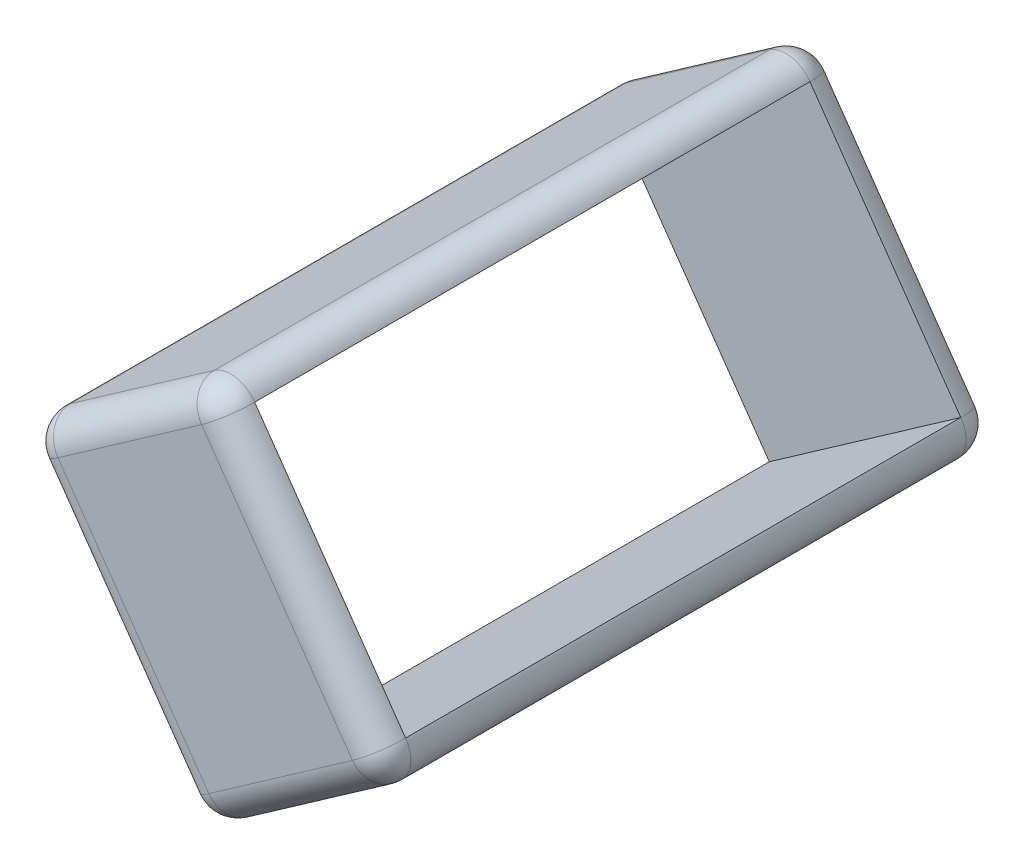
ISO-10303-21;
HEADER;
FILE_DESCRIPTION(('STEP AP214'),'2;1');
FILE_NAME('part.step','',(''),(''),'','','');
FILE_SCHEMA(('AUTOMOTIVE_DESIGN { 1 0 10303 214 1 1 1 1 }'));
ENDSEC;
DATA;
#1=APPLICATION_CONTEXT('core data for automotive mechanical design processes');
#2=APPLICATION_PROTOCOL_DEFINITION('international standard','automotive_design',2000,#1);
#3=PRODUCT_CONTEXT('',#1,'mechanical');
#4=PRODUCT('Part','Part','',(#3));
#5=PRODUCT_RELATED_PRODUCT_CATEGORY('part','',(#4));
#6=PRODUCT_DEFINITION_FORMATION('','',#4);
#7=PRODUCT_DEFINITION_CONTEXT('part definition',#1,'design');
#8=PRODUCT_DEFINITION('design','',#6,#7);
#9=PRODUCT_DEFINITION_SHAPE('','',#8);
#10=(LENGTH_UNIT() NAMED_UNIT(*) SI_UNIT(.MILLI.,.METRE.));
#11=(NAMED_UNIT(*) PLANE_ANGLE_UNIT() SI_UNIT($,.RADIAN.));
#12=(NAMED_UNIT(*) SI_UNIT($,.STERADIAN.) SOLID_ANGLE_UNIT());
#13=UNCERTAINTY_MEASURE_WITH_UNIT(LENGTH_MEASURE(1.E-05),#10,'distance_accuracy_value','');
#14=(GEOMETRIC_REPRESENTATION_CONTEXT(3) GLOBAL_UNCERTAINTY_ASSIGNED_CONTEXT((#13)) GLOBAL_UNIT_ASSIGNED_CONTEXT((#10,
#11,#12)) REPRESENTATION_CONTEXT('',''));
#15=CARTESIAN_POINT('',(0.,0.,0.));
#16=DIRECTION('',(0.,0.,1.));
#17=DIRECTION('',(1.,0.,0.));
#18=AXIS2_PLACEMENT_3D('',#15,#16,#17);
#19=CARTESIAN_POINT('',(11.0628027319125,-43.773106852629,10.5));
#20=DIRECTION('',(0.573576436351045,-0.819152044288993,0.));
#21=DIRECTION('',(0.819152044288993,0.573576436351045,0.));
#22=AXIS2_PLACEMENT_3D('',#19,#20,#21);
#23=PLANE('',#22);
#24=DIRECTION('',(0.,0.,-1.));
#25=VECTOR('',#24,1.);
#26=CARTESIAN_POINT('',(16.7968670419355,-39.7580717981717,10.5));
#27=LINE('',#26,#25);
#28=CARTESIAN_POINT('',(16.7968670419355,-39.7580717981717,9.5));
#29=VERTEX_POINT('',#28);
#30=CARTESIAN_POINT('',(16.7968670419355,-39.7580717981717,-9.5));
#31=VERTEX_POINT('',#30);
#32=EDGE_CURVE('E160',#29,#31,#27,.T.);
#33=ORIENTED_EDGE('',*,*,#32,.T.);
#34=DIRECTION('',(-0.819152044288993,-0.573576436351045,0.));
#35=VECTOR('',#34,1.);
#36=CARTESIAN_POINT('',(11.0628027319125,-43.773106852629,-9.5));
#37=LINE('',#36,#35);
#38=CARTESIAN_POINT('',(11.8819547762015,-43.199530416278,-9.5));
#39=VERTEX_POINT('',#38);
#40=EDGE_CURVE('E179',#31,#39,#37,.T.);
#41=ORIENTED_EDGE('',*,*,#40,.T.);
#42=DIRECTION('',(0.,0.,-1.));
#43=VECTOR('',#42,1.);
#44=CARTESIAN_POINT('',(11.8819547762015,-43.199530416278,10.5));
#45=LINE('',#44,#43);
#46=CARTESIAN_POINT('',(11.8819547762015,-43.199530416278,9.5));
#47=VERTEX_POINT('',#46);
#48=EDGE_CURVE('E278',#39,#47,#45,.F.);
#49=ORIENTED_EDGE('',*,*,#48,.T.);
#50=DIRECTION('',(-0.819152044288993,-0.573576436351045,0.));
#51=VECTOR('',#50,1.);
#52=CARTESIAN_POINT('',(17.6160190862244,-39.1844953618206,9.5));
#53=LINE('',#52,#51);
#54=EDGE_CURVE('E273',#47,#29,#53,.F.);
#55=ORIENTED_EDGE('',*,*,#54,.T.);
#56=EDGE_LOOP('',(#33,#41,#49,#55));
#57=FACE_BOUND('',#56,.T.);
#58=ADVANCED_FACE('F41',(#57),#23,.F.);
#59=CARTESIAN_POINT('',(23.9253598860859,-48.1951678489996,10.5));
#60=DIRECTION('',(-0.573576436351045,0.819152044288993,0.));
#61=DIRECTION('',(-0.819152044288993,-0.573576436351045,0.));
#62=AXIS2_PLACEMENT_3D('',#59,#60,#61);
#63=PLANE('',#62);
#64=DIRECTION('',(0.,0.,-1.));
#65=VECTOR('',#64,1.);
#66=CARTESIAN_POINT('',(18.191295576063,-52.2102029034569,10.5));
#67=LINE('',#66,#65);
#68=CARTESIAN_POINT('',(18.191295576063,-52.2102029034569,9.5));
#69=VERTEX_POINT('',#68);
#70=CARTESIAN_POINT('',(18.191295576063,-52.2102029034569,-9.5));
#71=VERTEX_POINT('',#70);
#72=EDGE_CURVE('E207',#69,#71,#67,.T.);
#73=ORIENTED_EDGE('',*,*,#72,.T.);
#74=DIRECTION('',(0.819152044288993,0.573576436351045,0.));
#75=VECTOR('',#74,1.);
#76=CARTESIAN_POINT('',(23.9253598860859,-48.1951678489996,-9.5));
#77=LINE('',#76,#75);
#78=CARTESIAN_POINT('',(23.1062078417969,-48.7687442853506,-9.5));
#79=VERTEX_POINT('',#78);
#80=EDGE_CURVE('E210',#71,#79,#77,.T.);
#81=ORIENTED_EDGE('',*,*,#80,.T.);
#82=DIRECTION('',(0.,0.,-1.));
#83=VECTOR('',#82,1.);
#84=CARTESIAN_POINT('',(23.1062078417969,-48.7687442853506,10.5));
#85=LINE('',#84,#83);
#86=CARTESIAN_POINT('',(23.1062078417969,-48.7687442853506,9.5));
#87=VERTEX_POINT('',#86);
#88=EDGE_CURVE('E205',#79,#87,#85,.F.);
#89=ORIENTED_EDGE('',*,*,#88,.T.);
#90=DIRECTION('',(0.819152044288993,0.573576436351045,0.));
#91=VECTOR('',#90,1.);
#92=CARTESIAN_POINT('',(17.372143531774,-52.7837793398079,9.5));
#93=LINE('',#92,#91);
#94=EDGE_CURVE('E203',#87,#69,#93,.F.);
#95=ORIENTED_EDGE('',*,*,#94,.T.);
#96=EDGE_LOOP('',(#73,#81,#89,#95));
#97=FACE_BOUND('',#96,.T.);
#98=ADVANCED_FACE('F339',(#97),#63,.F.);
#99=CARTESIAN_POINT('',(11.0628027319125,-43.773106852629,10.5));
#100=DIRECTION('',(0.,0.,1.));
#101=DIRECTION('',(1.,0.,0.));
#102=AXIS2_PLACEMENT_3D('',#99,#100,#101);
#103=PLANE('',#102);
#104=DIRECTION('',(0.819152044288993,0.573576436351045,0.));
#105=VECTOR('',#104,1.);
#106=CARTESIAN_POINT('',(23.3517834497349,-47.3760158047106,10.5));
#107=LINE('',#106,#105);
#108=CARTESIAN_POINT('',(17.6177191397119,-51.3910508591679,10.5));
#109=VERTEX_POINT('',#108);
#110=CARTESIAN_POINT('',(22.5326314054459,-47.9495922410616,10.5));
#111=VERTEX_POINT('',#110);
#112=EDGE_CURVE('E50',#109,#111,#107,.T.);
#113=ORIENTED_EDGE('',*,*,#112,.T.);
#114=DIRECTION('',(-0.573576436351044,0.819152044288993,0.));
#115=VECTOR('',#114,1.);
#116=CARTESIAN_POINT('',(16.7968670419355,-39.7580717981717,10.5));
#117=LINE('',#116,#115);
#118=CARTESIAN_POINT('',(17.3704434782865,-40.5772238424607,10.5));
#119=VERTEX_POINT('',#118);
#120=EDGE_CURVE('E11',#111,#119,#117,.T.);
#121=ORIENTED_EDGE('',*,*,#120,.T.);
#122=DIRECTION('',(-0.819152044288993,-0.573576436351045,0.));
#123=VECTOR('',#122,1.);
#124=CARTESIAN_POINT('',(11.6363791682635,-44.592258896918,10.5));
#125=LINE('',#124,#123);
#126=CARTESIAN_POINT('',(12.4555312125525,-44.0186824605669,10.5));
#127=VERTEX_POINT('',#126);
#128=EDGE_CURVE('E212',#119,#127,#125,.T.);
#129=ORIENTED_EDGE('',*,*,#128,.T.);
#130=DIRECTION('',(0.573576436351045,-0.819152044288993,0.));
#131=VECTOR('',#130,1.);
#132=CARTESIAN_POINT('',(18.191295576063,-52.2102029034569,10.5));
#133=LINE('',#132,#131);
#134=EDGE_CURVE('E61',#127,#109,#133,.T.);
#135=ORIENTED_EDGE('',*,*,#134,.T.);
#136=EDGE_LOOP('',(#113,#121,#129,#135));
#137=FACE_BOUND('',#136,.T.);
#138=ADVANCED_FACE('F337',(#137),#103,.T.);
#139=CARTESIAN_POINT('',(11.0628027319125,-43.773106852629,-10.5));
#140=DIRECTION('',(0.,0.,1.));
#141=DIRECTION('',(1.,0.,0.));
#142=AXIS2_PLACEMENT_3D('',#139,#140,#141);
#143=PLANE('',#142);
#144=DIRECTION('',(0.573576436351045,-0.819152044288993,0.));
#145=VECTOR('',#144,1.);
#146=CARTESIAN_POINT('',(11.8819547762015,-43.199530416278,-10.5));
#147=LINE('',#146,#145);
#148=CARTESIAN_POINT('',(17.6177191397119,-51.3910508591679,-10.5));
#149=VERTEX_POINT('',#148);
#150=CARTESIAN_POINT('',(12.4555312125525,-44.0186824605669,-10.5));
#151=VERTEX_POINT('',#150);
#152=EDGE_CURVE('E198',#149,#151,#147,.F.);
#153=ORIENTED_EDGE('',*,*,#152,.T.);
#154=DIRECTION('',(-0.819152044288993,-0.573576436351045,0.));
#155=VECTOR('',#154,1.);
#156=CARTESIAN_POINT('',(11.6363791682635,-44.592258896918,-10.5));
#157=LINE('',#156,#155);
#158=CARTESIAN_POINT('',(17.3704434782865,-40.5772238424607,-10.5));
#159=VERTEX_POINT('',#158);
#160=EDGE_CURVE('E201',#151,#159,#157,.F.);
#161=ORIENTED_EDGE('',*,*,#160,.T.);
#162=DIRECTION('',(-0.573576436351044,0.819152044288993,0.));
#163=VECTOR('',#162,1.);
#164=CARTESIAN_POINT('',(16.7968670419355,-39.7580717981717,-10.5));
#165=LINE('',#164,#163);
#166=CARTESIAN_POINT('',(22.5326314054459,-47.9495922410616,-10.5));
#167=VERTEX_POINT('',#166);
#168=EDGE_CURVE('E196',#159,#167,#165,.F.);
#169=ORIENTED_EDGE('',*,*,#168,.T.);
#170=DIRECTION('',(0.819152044288993,0.573576436351045,0.));
#171=VECTOR('',#170,1.);
#172=CARTESIAN_POINT('',(16.7985670954229,-51.9646272955189,-10.5));
#173=LINE('',#172,#171);
#174=EDGE_CURVE('E194',#167,#149,#173,.F.);
#175=ORIENTED_EDGE('',*,*,#174,.T.);
#176=EDGE_LOOP('',(#153,#161,#169,#175));
#177=FACE_BOUND('',#176,.T.);
#178=ADVANCED_FACE('F303',(#177),#143,.F.);
#179=CARTESIAN_POINT('',(17.6177191397119,-51.3910508591679,10.5));
#180=DIRECTION('',(0.,0.,-1.));
#181=DIRECTION('',(-1.,0.,0.));
#182=AXIS2_PLACEMENT_3D('',#179,#180,#181);
#183=CYLINDRICAL_SURFACE('',#182,1.);
#184=CARTESIAN_POINT('',(17.6177191397119,-51.3910508591679,9.5));
#185=DIRECTION('',(0.,0.,1.));
#186=DIRECTION('',(1.,0.,0.));
#187=AXIS2_PLACEMENT_3D('',#184,#185,#186);
#188=CIRCLE('',#187,1.);
#189=CARTESIAN_POINT('',(16.7985670954229,-51.9646272955189,9.5));
#190=VERTEX_POINT('',#189);
#191=EDGE_CURVE('E45',#190,#69,#188,.T.);
#192=ORIENTED_EDGE('',*,*,#191,.F.);
#193=DIRECTION('',(0.,0.,-1.));
#194=VECTOR('',#193,1.);
#195=CARTESIAN_POINT('',(16.7985670954229,-51.9646272955189,10.5));
#196=LINE('',#195,#194);
#197=CARTESIAN_POINT('',(16.7985670954229,-51.9646272955189,-9.5));
#198=VERTEX_POINT('',#197);
#199=EDGE_CURVE('E187',#198,#190,#196,.F.);
#200=ORIENTED_EDGE('',*,*,#199,.F.);
#201=CARTESIAN_POINT('',(17.6177191397119,-51.3910508591679,-9.5));
#202=DIRECTION('',(0.,0.,-1.));
#203=DIRECTION('',(-1.,0.,0.));
#204=AXIS2_PLACEMENT_3D('',#201,#202,#203);
#205=CIRCLE('',#204,1.);
#206=EDGE_CURVE('E266',#71,#198,#205,.T.);
#207=ORIENTED_EDGE('',*,*,#206,.F.);
#208=ORIENTED_EDGE('',*,*,#72,.F.);
#209=EDGE_LOOP('',(#192,#200,#207,#208));
#210=FACE_BOUND('',#209,.T.);
#211=ADVANCED_FACE('F43',(#210),#183,.T.);
#212=CARTESIAN_POINT('',(17.6177191397119,-51.3910508591679,9.5));
#213=DIRECTION('',(0.,0.,1.));
#214=DIRECTION('',(1.,0.,0.));
#215=AXIS2_PLACEMENT_3D('',#212,#213,#214);
#216=SPHERICAL_SURFACE('',#215,1.);
#217=CARTESIAN_POINT('',(17.6177191397119,-51.3910508591679,9.5));
#218=DIRECTION('',(0.573576436351045,-0.819152044288993,0.));
#219=DIRECTION('',(0.819152044288993,0.573576436351045,0.));
#220=AXIS2_PLACEMENT_3D('',#217,#218,#219);
#221=CIRCLE('',#220,1.);
#222=EDGE_CURVE('E262',#190,#109,#221,.F.);
#223=ORIENTED_EDGE('',*,*,#222,.F.);
#224=ORIENTED_EDGE('',*,*,#191,.T.);
#225=CARTESIAN_POINT('',(17.6177191397119,-51.3910508591679,9.5));
#226=DIRECTION('',(-0.819152044288993,-0.573576436351045,0.));
#227=DIRECTION('',(0.573576436351045,-0.819152044288993,0.));
#228=AXIS2_PLACEMENT_3D('',#225,#226,#227);
#229=CIRCLE('',#228,1.);
#230=EDGE_CURVE('E264',#109,#69,#229,.F.);
#231=ORIENTED_EDGE('',*,*,#230,.F.);
#232=EDGE_LOOP('',(#223,#224,#231));
#233=FACE_BOUND('',#232,.T.);
#234=ADVANCED_FACE('F329',(#233),#216,.T.);
#235=CARTESIAN_POINT('',(17.6177191397119,-51.3910508591679,-9.5));
#236=DIRECTION('',(0.,0.,1.));
#237=DIRECTION('',(1.,0.,0.));
#238=AXIS2_PLACEMENT_3D('',#235,#236,#237);
#239=SPHERICAL_SURFACE('',#238,1.);
#240=CARTESIAN_POINT('',(17.6177191397119,-51.3910508591679,-9.5));
#241=DIRECTION('',(-0.819152044288993,-0.573576436351045,0.));
#242=DIRECTION('',(0.573576436351045,-0.819152044288993,0.));
#243=AXIS2_PLACEMENT_3D('',#240,#241,#242);
#244=CIRCLE('',#243,1.);
#245=EDGE_CURVE('E256',#71,#149,#244,.F.);
#246=ORIENTED_EDGE('',*,*,#245,.F.);
#247=ORIENTED_EDGE('',*,*,#206,.T.);
#248=CARTESIAN_POINT('',(17.6177191397119,-51.3910508591679,-9.5));
#249=DIRECTION('',(0.573576436351045,-0.819152044288993,0.));
#250=DIRECTION('',(0.819152044288993,0.573576436351045,0.));
#251=AXIS2_PLACEMENT_3D('',#248,#249,#250);
#252=CIRCLE('',#251,1.);
#253=EDGE_CURVE('E259',#149,#198,#252,.F.);
#254=ORIENTED_EDGE('',*,*,#253,.F.);
#255=EDGE_LOOP('',(#246,#247,#254));
#256=FACE_BOUND('',#255,.T.);
#257=ADVANCED_FACE('F316',(#256),#239,.T.);
#258=CARTESIAN_POINT('',(16.7985670954229,-51.9646272955189,9.5));
#259=DIRECTION('',(-0.819152044288993,-0.573576436351045,0.));
#260=DIRECTION('',(0.573576436351045,-0.819152044288993,0.));
#261=AXIS2_PLACEMENT_3D('',#258,#259,#260);
#262=CYLINDRICAL_SURFACE('',#261,1.);
#263=ORIENTED_EDGE('',*,*,#230,.T.);
#264=ORIENTED_EDGE('',*,*,#94,.F.);
#265=CARTESIAN_POINT('',(22.5326314054459,-47.9495922410616,9.5));
#266=DIRECTION('',(0.819152044288993,0.573576436351045,0.));
#267=DIRECTION('',(-0.573576436351045,0.819152044288993,0.));
#268=AXIS2_PLACEMENT_3D('',#265,#266,#267);
#269=CIRCLE('',#268,1.);
#270=EDGE_CURVE('E250',#111,#87,#269,.T.);
#271=ORIENTED_EDGE('',*,*,#270,.F.);
#272=ORIENTED_EDGE('',*,*,#112,.F.);
#273=EDGE_LOOP('',(#263,#264,#271,#272));
#274=FACE_BOUND('',#273,.T.);
#275=ADVANCED_FACE('F392',(#274),#262,.T.);
#276=CARTESIAN_POINT('',(11.8819547762015,-43.199530416278,9.5));
#277=DIRECTION('',(-0.573576436351045,0.819152044288993,0.));
#278=DIRECTION('',(-0.819152044288993,-0.573576436351045,0.));
#279=AXIS2_PLACEMENT_3D('',#276,#277,#278);
#280=CYLINDRICAL_SURFACE('',#279,1.);
#281=ORIENTED_EDGE('',*,*,#222,.T.);
#282=ORIENTED_EDGE('',*,*,#134,.F.);
#283=CARTESIAN_POINT('',(12.4555312125525,-44.0186824605669,9.5));
#284=DIRECTION('',(-0.573576436351045,0.819152044288993,0.));
#285=DIRECTION('',(-0.819152044288993,-0.573576436351045,0.));
#286=AXIS2_PLACEMENT_3D('',#283,#284,#285);
#287=CIRCLE('',#286,1.);
#288=CARTESIAN_POINT('',(11.6363791682635,-44.592258896918,9.5));
#289=VERTEX_POINT('',#288);
#290=EDGE_CURVE('E247',#289,#127,#287,.T.);
#291=ORIENTED_EDGE('',*,*,#290,.F.);
#292=DIRECTION('',(0.573576436351045,-0.819152044288993,0.));
#293=VECTOR('',#292,1.);
#294=CARTESIAN_POINT('',(11.0628027319125,-43.773106852629,9.5));
#295=LINE('',#294,#293);
#296=EDGE_CURVE('E136',#190,#289,#295,.F.);
#297=ORIENTED_EDGE('',*,*,#296,.F.);
#298=EDGE_LOOP('',(#281,#282,#291,#297));
#299=FACE_BOUND('',#298,.T.);
#300=ADVANCED_FACE('F332',(#299),#280,.T.);
#301=CARTESIAN_POINT('',(12.4555312125525,-44.0186824605669,10.5));
#302=DIRECTION('',(0.,0.,-1.));
#303=DIRECTION('',(-1.,0.,0.));
#304=AXIS2_PLACEMENT_3D('',#301,#302,#303);
#305=CYLINDRICAL_SURFACE('',#304,1.);
#306=CARTESIAN_POINT('',(12.4555312125525,-44.0186824605669,-9.5));
#307=DIRECTION('',(0.,0.,-1.));
#308=DIRECTION('',(-1.,0.,0.));
#309=AXIS2_PLACEMENT_3D('',#306,#307,#308);
#310=CIRCLE('',#309,1.);
#311=CARTESIAN_POINT('',(11.6363791682635,-44.592258896918,-9.5));
#312=VERTEX_POINT('',#311);
#313=EDGE_CURVE('E241',#312,#39,#310,.T.);
#314=ORIENTED_EDGE('',*,*,#313,.F.);
#315=DIRECTION('',(0.,0.,-1.));
#316=VECTOR('',#315,1.);
#317=CARTESIAN_POINT('',(11.6363791682635,-44.592258896918,10.5));
#318=LINE('',#317,#316);
#319=EDGE_CURVE('E192',#289,#312,#318,.T.);
#320=ORIENTED_EDGE('',*,*,#319,.F.);
#321=CARTESIAN_POINT('',(12.4555312125525,-44.0186824605669,9.5));
#322=DIRECTION('',(0.,0.,1.));
#323=DIRECTION('',(1.,0.,0.));
#324=AXIS2_PLACEMENT_3D('',#321,#322,#323);
#325=CIRCLE('',#324,1.);
#326=EDGE_CURVE('E244',#47,#289,#325,.T.);
#327=ORIENTED_EDGE('',*,*,#326,.F.);
#328=ORIENTED_EDGE('',*,*,#48,.F.);
#329=EDGE_LOOP('',(#314,#320,#327,#328));
#330=FACE_BOUND('',#329,.T.);
#331=ADVANCED_FACE('F293',(#330),#305,.T.);
#332=CARTESIAN_POINT('',(18.191295576063,-52.2102029034569,-9.5));
#333=DIRECTION('',(0.573576436351045,-0.819152044288993,0.));
#334=DIRECTION('',(0.819152044288993,0.573576436351045,0.));
#335=AXIS2_PLACEMENT_3D('',#332,#333,#334);
#336=CYLINDRICAL_SURFACE('',#335,1.);
#337=ORIENTED_EDGE('',*,*,#253,.T.);
#338=DIRECTION('',(0.573576436351045,-0.819152044288993,0.));
#339=VECTOR('',#338,1.);
#340=CARTESIAN_POINT('',(17.372143531774,-52.7837793398079,-9.5));
#341=LINE('',#340,#339);
#342=EDGE_CURVE('E190',#312,#198,#341,.T.);
#343=ORIENTED_EDGE('',*,*,#342,.F.);
#344=CARTESIAN_POINT('',(12.4555312125525,-44.0186824605669,-9.5));
#345=DIRECTION('',(-0.573576436351045,0.819152044288993,0.));
#346=DIRECTION('',(-0.819152044288993,-0.573576436351045,0.));
#347=AXIS2_PLACEMENT_3D('',#344,#345,#346);
#348=CIRCLE('',#347,1.);
#349=EDGE_CURVE('E238',#151,#312,#348,.T.);
#350=ORIENTED_EDGE('',*,*,#349,.F.);
#351=ORIENTED_EDGE('',*,*,#152,.F.);
#352=EDGE_LOOP('',(#337,#343,#350,#351));
#353=FACE_BOUND('',#352,.T.);
#354=ADVANCED_FACE('F318',(#353),#336,.T.);
#355=CARTESIAN_POINT('',(23.3517834497349,-47.3760158047106,-9.5));
#356=DIRECTION('',(0.819152044288993,0.573576436351045,0.));
#357=DIRECTION('',(-0.573576436351045,0.819152044288993,0.));
#358=AXIS2_PLACEMENT_3D('',#355,#356,#357);
#359=CYLINDRICAL_SURFACE('',#358,1.);
#360=ORIENTED_EDGE('',*,*,#245,.T.);
#361=ORIENTED_EDGE('',*,*,#174,.F.);
#362=CARTESIAN_POINT('',(22.5326314054459,-47.9495922410616,-9.5));
#363=DIRECTION('',(0.819152044288993,0.573576436351045,0.));
#364=DIRECTION('',(-0.573576436351045,0.819152044288993,0.));
#365=AXIS2_PLACEMENT_3D('',#362,#363,#364);
#366=CIRCLE('',#365,1.);
#367=EDGE_CURVE('E235',#79,#167,#366,.T.);
#368=ORIENTED_EDGE('',*,*,#367,.F.);
#369=ORIENTED_EDGE('',*,*,#80,.F.);
#370=EDGE_LOOP('',(#360,#361,#368,#369));
#371=FACE_BOUND('',#370,.T.);
#372=ADVANCED_FACE('F315',(#371),#359,.T.);
#373=CARTESIAN_POINT('',(22.5326314054459,-47.9495922410616,10.5));
#374=DIRECTION('',(0.,0.,-1.));
#375=DIRECTION('',(-1.,0.,0.));
#376=AXIS2_PLACEMENT_3D('',#373,#374,#375);
#377=CYLINDRICAL_SURFACE('',#376,1.);
#378=CARTESIAN_POINT('',(22.5326314054459,-47.9495922410616,9.5));
#379=DIRECTION('',(0.,0.,1.));
#380=DIRECTION('',(1.,0.,0.));
#381=AXIS2_PLACEMENT_3D('',#378,#379,#380);
#382=CIRCLE('',#381,1.);
#383=CARTESIAN_POINT('',(23.3517834497349,-47.3760158047106,9.5));
#384=VERTEX_POINT('',#383);
#385=EDGE_CURVE('E253',#87,#384,#382,.T.);
#386=ORIENTED_EDGE('',*,*,#385,.F.);
#387=ORIENTED_EDGE('',*,*,#88,.F.);
#388=CARTESIAN_POINT('',(22.5326314054459,-47.9495922410616,-9.5));
#389=DIRECTION('',(0.,0.,-1.));
#390=DIRECTION('',(-1.,0.,0.));
#391=AXIS2_PLACEMENT_3D('',#388,#389,#390);
#392=CIRCLE('',#391,1.);
#393=CARTESIAN_POINT('',(23.3517834497349,-47.3760158047106,-9.5));
#394=VERTEX_POINT('',#393);
#395=EDGE_CURVE('E232',#394,#79,#392,.T.);
#396=ORIENTED_EDGE('',*,*,#395,.F.);
#397=DIRECTION('',(0.,0.,-1.));
#398=VECTOR('',#397,1.);
#399=CARTESIAN_POINT('',(23.3517834497349,-47.3760158047106,10.5));
#400=LINE('',#399,#398);
#401=EDGE_CURVE('E178',#384,#394,#400,.T.);
#402=ORIENTED_EDGE('',*,*,#401,.F.);
#403=EDGE_LOOP('',(#386,#387,#396,#402));
#404=FACE_BOUND('',#403,.T.);
#405=ADVANCED_FACE('F379',(#404),#377,.T.);
#406=CARTESIAN_POINT('',(22.5326314054459,-47.9495922410616,9.5));
#407=DIRECTION('',(0.,0.,1.));
#408=DIRECTION('',(1.,0.,0.));
#409=AXIS2_PLACEMENT_3D('',#406,#407,#408);
#410=SPHERICAL_SURFACE('',#409,1.);
#411=ORIENTED_EDGE('',*,*,#270,.T.);
#412=ORIENTED_EDGE('',*,*,#385,.T.);
#413=CARTESIAN_POINT('',(22.5326314054459,-47.9495922410616,9.5));
#414=DIRECTION('',(0.573576436351045,-0.819152044288993,0.));
#415=DIRECTION('',(0.819152044288993,0.573576436351045,0.));
#416=AXIS2_PLACEMENT_3D('',#413,#414,#415);
#417=CIRCLE('',#416,1.);
#418=EDGE_CURVE('E177',#111,#384,#417,.F.);
#419=ORIENTED_EDGE('',*,*,#418,.F.);
#420=EDGE_LOOP('',(#411,#412,#419));
#421=FACE_BOUND('',#420,.T.);
#422=ADVANCED_FACE('F376',(#421),#410,.T.);
#423=CARTESIAN_POINT('',(12.4555312125525,-44.0186824605669,9.5));
#424=DIRECTION('',(0.,0.,1.));
#425=DIRECTION('',(1.,0.,0.));
#426=AXIS2_PLACEMENT_3D('',#423,#424,#425);
#427=SPHERICAL_SURFACE('',#426,1.);
#428=ORIENTED_EDGE('',*,*,#326,.T.);
#429=ORIENTED_EDGE('',*,*,#290,.T.);
#430=CARTESIAN_POINT('',(12.4555312125525,-44.0186824605669,9.5));
#431=DIRECTION('',(-0.819152044288993,-0.573576436351045,0.));
#432=DIRECTION('',(0.573576436351045,-0.819152044288993,0.));
#433=AXIS2_PLACEMENT_3D('',#430,#431,#432);
#434=CIRCLE('',#433,1.);
#435=EDGE_CURVE('E228',#47,#127,#434,.F.);
#436=ORIENTED_EDGE('',*,*,#435,.F.);
#437=EDGE_LOOP('',(#428,#429,#436));
#438=FACE_BOUND('',#437,.T.);
#439=ADVANCED_FACE('F334',(#438),#427,.T.);
#440=CARTESIAN_POINT('',(12.4555312125525,-44.0186824605669,-9.5));
#441=DIRECTION('',(0.,0.,1.));
#442=DIRECTION('',(1.,0.,0.));
#443=AXIS2_PLACEMENT_3D('',#440,#441,#442);
#444=SPHERICAL_SURFACE('',#443,1.);
#445=ORIENTED_EDGE('',*,*,#349,.T.);
#446=ORIENTED_EDGE('',*,*,#313,.T.);
#447=CARTESIAN_POINT('',(12.4555312125525,-44.0186824605669,-9.5));
#448=DIRECTION('',(-0.819152044288993,-0.573576436351045,0.));
#449=DIRECTION('',(0.573576436351045,-0.819152044288993,0.));
#450=AXIS2_PLACEMENT_3D('',#447,#448,#449);
#451=CIRCLE('',#450,1.);
#452=EDGE_CURVE('E225',#151,#39,#451,.F.);
#453=ORIENTED_EDGE('',*,*,#452,.F.);
#454=EDGE_LOOP('',(#445,#446,#453));
#455=FACE_BOUND('',#454,.T.);
#456=ADVANCED_FACE('F298',(#455),#444,.T.);
#457=CARTESIAN_POINT('',(22.5326314054459,-47.9495922410616,-9.5));
#458=DIRECTION('',(0.,0.,1.));
#459=DIRECTION('',(1.,0.,0.));
#460=AXIS2_PLACEMENT_3D('',#457,#458,#459);
#461=SPHERICAL_SURFACE('',#460,1.);
#462=ORIENTED_EDGE('',*,*,#395,.T.);
#463=ORIENTED_EDGE('',*,*,#367,.T.);
#464=CARTESIAN_POINT('',(22.5326314054459,-47.9495922410616,-9.5));
#465=DIRECTION('',(0.573576436351043,-0.819152044288994,0.));
#466=DIRECTION('',(0.819152044288994,0.573576436351043,0.));
#467=AXIS2_PLACEMENT_3D('',#464,#465,#466);
#468=CIRCLE('',#467,1.);
#469=EDGE_CURVE('E172',#394,#167,#468,.F.);
#470=ORIENTED_EDGE('',*,*,#469,.F.);
#471=EDGE_LOOP('',(#462,#463,#470));
#472=FACE_BOUND('',#471,.T.);
#473=ADVANCED_FACE('F311',(#472),#461,.T.);
#474=CARTESIAN_POINT('',(16.7968670419355,-39.7580717981717,9.5));
#475=DIRECTION('',(0.573576436351044,-0.819152044288993,0.));
#476=DIRECTION('',(0.819152044288993,0.573576436351044,0.));
#477=AXIS2_PLACEMENT_3D('',#474,#475,#476);
#478=CYLINDRICAL_SURFACE('',#477,1.);
#479=ORIENTED_EDGE('',*,*,#418,.T.);
#480=DIRECTION('',(-0.573576436351044,0.819152044288993,0.));
#481=VECTOR('',#480,1.);
#482=CARTESIAN_POINT('',(23.9253598860859,-48.1951678489996,9.5));
#483=LINE('',#482,#481);
#484=CARTESIAN_POINT('',(18.1895955225755,-40.0036474061096,9.5));
#485=VERTEX_POINT('',#484);
#486=EDGE_CURVE('E133',#485,#384,#483,.F.);
#487=ORIENTED_EDGE('',*,*,#486,.F.);
#488=CARTESIAN_POINT('',(17.3704434782865,-40.5772238424607,9.5));
#489=DIRECTION('',(-0.573576436351045,0.819152044288993,0.));
#490=DIRECTION('',(-0.819152044288993,-0.573576436351045,0.));
#491=AXIS2_PLACEMENT_3D('',#488,#489,#490);
#492=CIRCLE('',#491,1.);
#493=EDGE_CURVE('E165',#119,#485,#492,.T.);
#494=ORIENTED_EDGE('',*,*,#493,.F.);
#495=ORIENTED_EDGE('',*,*,#120,.F.);
#496=EDGE_LOOP('',(#479,#487,#494,#495));
#497=FACE_BOUND('',#496,.T.);
#498=ADVANCED_FACE('F175',(#497),#478,.T.);
#499=CARTESIAN_POINT('',(11.6363791682635,-44.592258896918,9.5));
#500=DIRECTION('',(0.819152044288993,0.573576436351045,0.));
#501=DIRECTION('',(-0.573576436351045,0.819152044288993,0.));
#502=AXIS2_PLACEMENT_3D('',#499,#500,#501);
#503=CYLINDRICAL_SURFACE('',#502,1.);
#504=ORIENTED_EDGE('',*,*,#435,.T.);
#505=ORIENTED_EDGE('',*,*,#128,.F.);
#506=CARTESIAN_POINT('',(17.3704434782865,-40.5772238424607,9.5));
#507=DIRECTION('',(0.819152044288993,0.573576436351045,0.));
#508=DIRECTION('',(-0.573576436351045,0.819152044288993,0.));
#509=AXIS2_PLACEMENT_3D('',#506,#507,#508);
#510=CIRCLE('',#509,1.);
#511=EDGE_CURVE('E168',#29,#119,#510,.T.);
#512=ORIENTED_EDGE('',*,*,#511,.F.);
#513=ORIENTED_EDGE('',*,*,#54,.F.);
#514=EDGE_LOOP('',(#504,#505,#512,#513));
#515=FACE_BOUND('',#514,.T.);
#516=ADVANCED_FACE('F336',(#515),#503,.T.);
#517=CARTESIAN_POINT('',(11.6363791682635,-44.592258896918,-9.5));
#518=DIRECTION('',(-0.819152044288993,-0.573576436351045,0.));
#519=DIRECTION('',(0.573576436351045,-0.819152044288993,0.));
#520=AXIS2_PLACEMENT_3D('',#517,#518,#519);
#521=CYLINDRICAL_SURFACE('',#520,1.);
#522=ORIENTED_EDGE('',*,*,#452,.T.);
#523=ORIENTED_EDGE('',*,*,#40,.F.);
#524=CARTESIAN_POINT('',(17.3704434782865,-40.5772238424607,-9.5));
#525=DIRECTION('',(0.819152044288993,0.573576436351045,0.));
#526=DIRECTION('',(-0.573576436351045,0.819152044288993,0.));
#527=AXIS2_PLACEMENT_3D('',#524,#525,#526);
#528=CIRCLE('',#527,1.);
#529=EDGE_CURVE('E219',#159,#31,#528,.T.);
#530=ORIENTED_EDGE('',*,*,#529,.F.);
#531=ORIENTED_EDGE('',*,*,#160,.F.);
#532=EDGE_LOOP('',(#522,#523,#530,#531));
#533=FACE_BOUND('',#532,.T.);
#534=ADVANCED_FACE('F300',(#533),#521,.T.);
#535=CARTESIAN_POINT('',(16.7968670419355,-39.7580717981717,-9.5));
#536=DIRECTION('',(-0.573576436351044,0.819152044288993,0.));
#537=DIRECTION('',(-0.819152044288993,-0.573576436351044,0.));
#538=AXIS2_PLACEMENT_3D('',#535,#536,#537);
#539=CYLINDRICAL_SURFACE('',#538,1.);
#540=ORIENTED_EDGE('',*,*,#469,.T.);
#541=ORIENTED_EDGE('',*,*,#168,.F.);
#542=CARTESIAN_POINT('',(17.3704434782865,-40.5772238424607,-9.5));
#543=DIRECTION('',(-0.573576436351045,0.819152044288993,0.));
#544=DIRECTION('',(-0.819152044288993,-0.573576436351045,0.));
#545=AXIS2_PLACEMENT_3D('',#542,#543,#544);
#546=CIRCLE('',#545,1.);
#547=CARTESIAN_POINT('',(18.1895955225755,-40.0036474061096,-9.5));
#548=VERTEX_POINT('',#547);
#549=EDGE_CURVE('E162',#548,#159,#546,.T.);
#550=ORIENTED_EDGE('',*,*,#549,.F.);
#551=DIRECTION('',(-0.573576436351044,0.819152044288993,0.));
#552=VECTOR('',#551,1.);
#553=CARTESIAN_POINT('',(17.6160190862244,-39.1844953618206,-9.5));
#554=LINE('',#553,#552);
#555=EDGE_CURVE('E152',#394,#548,#554,.T.);
#556=ORIENTED_EDGE('',*,*,#555,.F.);
#557=EDGE_LOOP('',(#540,#541,#550,#556));
#558=FACE_BOUND('',#557,.T.);
#559=ADVANCED_FACE('F307',(#558),#539,.T.);
#560=CARTESIAN_POINT('',(17.3704434782865,-40.5772238424607,9.5));
#561=DIRECTION('',(0.,0.,1.));
#562=DIRECTION('',(1.,0.,0.));
#563=AXIS2_PLACEMENT_3D('',#560,#561,#562);
#564=SPHERICAL_SURFACE('',#563,1.);
#565=ORIENTED_EDGE('',*,*,#511,.T.);
#566=ORIENTED_EDGE('',*,*,#493,.T.);
#567=CARTESIAN_POINT('',(17.3704434782865,-40.5772238424607,9.5));
#568=DIRECTION('',(0.,0.,1.));
#569=DIRECTION('',(1.,0.,0.));
#570=AXIS2_PLACEMENT_3D('',#567,#568,#569);
#571=CIRCLE('',#570,1.);
#572=EDGE_CURVE('E156',#29,#485,#571,.F.);
#573=ORIENTED_EDGE('',*,*,#572,.F.);
#574=EDGE_LOOP('',(#565,#566,#573));
#575=FACE_BOUND('',#574,.T.);
#576=ADVANCED_FACE('F166',(#575),#564,.T.);
#577=CARTESIAN_POINT('',(17.3704434782865,-40.5772238424607,-9.5));
#578=DIRECTION('',(0.,0.,1.));
#579=DIRECTION('',(1.,0.,0.));
#580=AXIS2_PLACEMENT_3D('',#577,#578,#579);
#581=SPHERICAL_SURFACE('',#580,1.);
#582=ORIENTED_EDGE('',*,*,#549,.T.);
#583=ORIENTED_EDGE('',*,*,#529,.T.);
#584=CARTESIAN_POINT('',(17.3704434782865,-40.5772238424607,-9.5));
#585=DIRECTION('',(0.,0.,-1.));
#586=DIRECTION('',(-1.,0.,0.));
#587=AXIS2_PLACEMENT_3D('',#584,#585,#586);
#588=CIRCLE('',#587,1.);
#589=EDGE_CURVE('E140',#548,#31,#588,.F.);
#590=ORIENTED_EDGE('',*,*,#589,.F.);
#591=EDGE_LOOP('',(#582,#583,#590));
#592=FACE_BOUND('',#591,.T.);
#593=ADVANCED_FACE('F356',(#592),#581,.T.);
#594=CARTESIAN_POINT('',(17.3704434782865,-40.5772238424607,10.5));
#595=DIRECTION('',(0.,0.,-1.));
#596=DIRECTION('',(-1.,0.,0.));
#597=AXIS2_PLACEMENT_3D('',#594,#595,#596);
#598=CYLINDRICAL_SURFACE('',#597,1.);
#599=ORIENTED_EDGE('',*,*,#572,.T.);
#600=DIRECTION('',(0.,0.,-1.));
#601=VECTOR('',#600,1.);
#602=CARTESIAN_POINT('',(18.1895955225755,-40.0036474061096,10.5));
#603=LINE('',#602,#601);
#604=EDGE_CURVE('E145',#548,#485,#603,.F.);
#605=ORIENTED_EDGE('',*,*,#604,.F.);
#606=ORIENTED_EDGE('',*,*,#589,.T.);
#607=ORIENTED_EDGE('',*,*,#32,.F.);
#608=EDGE_LOOP('',(#599,#605,#606,#607));
#609=FACE_BOUND('',#608,.T.);
#610=ADVANCED_FACE('F158',(#609),#598,.T.);
#611=CARTESIAN_POINT('',(11.6363791682635,-44.592258896918,10.5));
#612=DIRECTION('',(0.573576436351045,-0.819152044288993,0.));
#613=DIRECTION('',(0.819152044288993,0.573576436351045,0.));
#614=AXIS2_PLACEMENT_3D('',#611,#612,#613);
#615=PLANE('',#614);
#616=ORIENTED_EDGE('',*,*,#604,.T.);
#617=DIRECTION('',(-0.819152044288993,-0.573576436351045,0.));
#618=VECTOR('',#617,1.);
#619=CARTESIAN_POINT('',(11.6363791682635,-44.592258896918,9.5));
#620=LINE('',#619,#618);
#621=EDGE_CURVE('E129',#485,#289,#620,.T.);
#622=ORIENTED_EDGE('',*,*,#621,.T.);
#623=ORIENTED_EDGE('',*,*,#319,.T.);
#624=DIRECTION('',(-0.819152044288993,-0.573576436351045,0.));
#625=VECTOR('',#624,1.);
#626=CARTESIAN_POINT('',(11.6363791682635,-44.592258896918,-9.5));
#627=LINE('',#626,#625);
#628=EDGE_CURVE('E148',#548,#312,#627,.T.);
#629=ORIENTED_EDGE('',*,*,#628,.F.);
#630=EDGE_LOOP('',(#616,#622,#623,#629));
#631=FACE_BOUND('',#630,.T.);
#632=ADVANCED_FACE('F147',(#631),#615,.T.);
#633=CARTESIAN_POINT('',(23.3517834497349,-47.3760158047106,10.5));
#634=DIRECTION('',(-0.573576436351045,0.819152044288993,0.));
#635=DIRECTION('',(-0.819152044288993,-0.573576436351045,0.));
#636=AXIS2_PLACEMENT_3D('',#633,#634,#635);
#637=PLANE('',#636);
#638=ORIENTED_EDGE('',*,*,#199,.T.);
#639=DIRECTION('',(-0.819152044288993,-0.573576436351045,0.));
#640=VECTOR('',#639,1.);
#641=CARTESIAN_POINT('',(16.7985670954229,-51.9646272955189,9.5));
#642=LINE('',#641,#640);
#643=EDGE_CURVE('E141',#384,#190,#642,.T.);
#644=ORIENTED_EDGE('',*,*,#643,.F.);
#645=ORIENTED_EDGE('',*,*,#401,.T.);
#646=DIRECTION('',(-0.819152044288993,-0.573576436351045,0.));
#647=VECTOR('',#646,1.);
#648=CARTESIAN_POINT('',(16.7985670954229,-51.9646272955189,-9.5));
#649=LINE('',#648,#647);
#650=EDGE_CURVE('E284',#394,#198,#649,.T.);
#651=ORIENTED_EDGE('',*,*,#650,.T.);
#652=EDGE_LOOP('',(#638,#644,#645,#651));
#653=FACE_BOUND('',#652,.T.);
#654=ADVANCED_FACE('F325',(#653),#637,.T.);
#655=CARTESIAN_POINT('',(11.0628027319125,-43.773106852629,9.5));
#656=DIRECTION('',(0.,0.,1.));
#657=DIRECTION('',(1.,0.,0.));
#658=AXIS2_PLACEMENT_3D('',#655,#656,#657);
#659=PLANE('',#658);
#660=ORIENTED_EDGE('',*,*,#643,.T.);
#661=ORIENTED_EDGE('',*,*,#296,.T.);
#662=ORIENTED_EDGE('',*,*,#621,.F.);
#663=ORIENTED_EDGE('',*,*,#486,.T.);
#664=EDGE_LOOP('',(#660,#661,#662,#663));
#665=FACE_BOUND('',#664,.T.);
#666=ADVANCED_FACE('F131',(#665),#659,.F.);
#667=CARTESIAN_POINT('',(11.0628027319125,-43.773106852629,-9.5));
#668=DIRECTION('',(0.,0.,1.));
#669=DIRECTION('',(1.,0.,0.));
#670=AXIS2_PLACEMENT_3D('',#667,#668,#669);
#671=PLANE('',#670);
#672=ORIENTED_EDGE('',*,*,#342,.T.);
#673=ORIENTED_EDGE('',*,*,#650,.F.);
#674=ORIENTED_EDGE('',*,*,#555,.T.);
#675=ORIENTED_EDGE('',*,*,#628,.T.);
#676=EDGE_LOOP('',(#672,#673,#674,#675));
#677=FACE_BOUND('',#676,.T.);
#678=ADVANCED_FACE('F322',(#677),#671,.T.);
#679=CLOSED_SHELL('',(#58,#98,#138,#178,#211,#234,#257,#275,#300,#331,#354,#372,#405,#422,#439,
#456,#473,#498,#516,#534,#559,#576,#593,#610,#632,#654,#666,#678));
#680=MANIFOLD_SOLID_BREP('B2',#679);
#681=ADVANCED_BREP_SHAPE_REPRESENTATION('',(#18,#680),#14);
#682=SHAPE_DEFINITION_REPRESENTATION(#9,#681);
ENDSEC;
END-ISO-10303-21;
